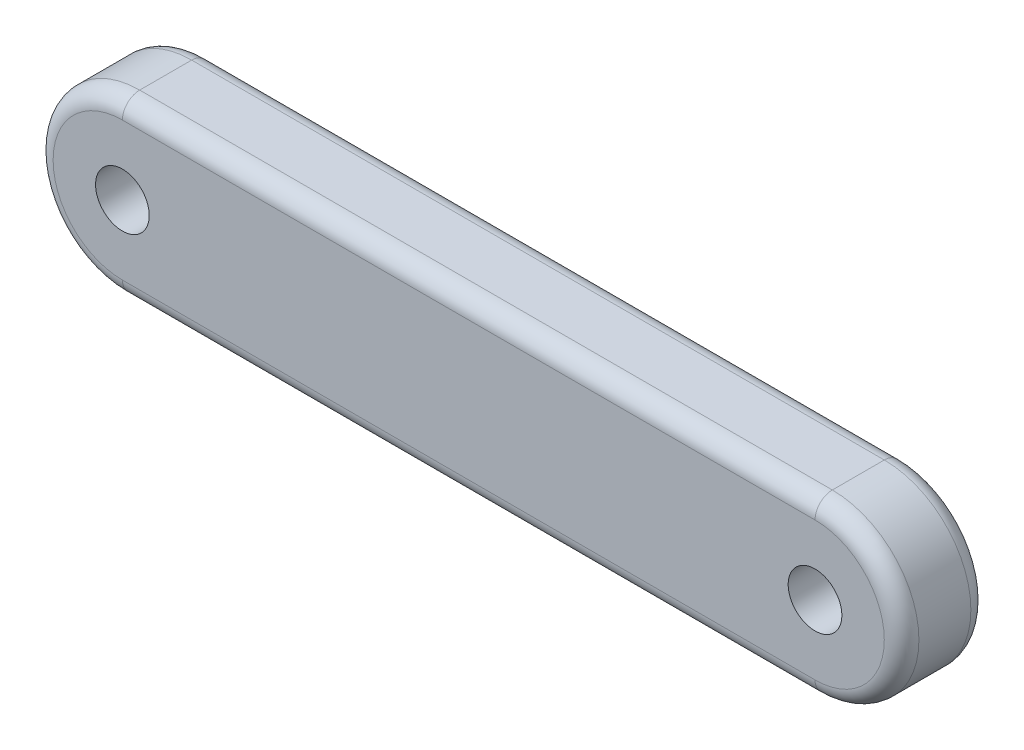
ISO-10303-21;
HEADER;
FILE_DESCRIPTION(('STEP AP214'),'2;1');
FILE_NAME('part.step','',(''),(''),'','','');
FILE_SCHEMA(('AUTOMOTIVE_DESIGN { 1 0 10303 214 1 1 1 1 }'));
ENDSEC;
DATA;
#1=APPLICATION_CONTEXT('core data for automotive mechanical design processes');
#2=APPLICATION_PROTOCOL_DEFINITION('international standard','automotive_design',2000,#1);
#3=PRODUCT_CONTEXT('',#1,'mechanical');
#4=PRODUCT('Part','Part','',(#3));
#5=PRODUCT_RELATED_PRODUCT_CATEGORY('part','',(#4));
#6=PRODUCT_DEFINITION_FORMATION('','',#4);
#7=PRODUCT_DEFINITION_CONTEXT('part definition',#1,'design');
#8=PRODUCT_DEFINITION('design','',#6,#7);
#9=PRODUCT_DEFINITION_SHAPE('','',#8);
#10=(LENGTH_UNIT() NAMED_UNIT(*) SI_UNIT(.MILLI.,.METRE.));
#11=(NAMED_UNIT(*) PLANE_ANGLE_UNIT() SI_UNIT($,.RADIAN.));
#12=(NAMED_UNIT(*) SI_UNIT($,.STERADIAN.) SOLID_ANGLE_UNIT());
#13=UNCERTAINTY_MEASURE_WITH_UNIT(LENGTH_MEASURE(1.E-05),#10,'distance_accuracy_value','');
#14=(GEOMETRIC_REPRESENTATION_CONTEXT(3) GLOBAL_UNCERTAINTY_ASSIGNED_CONTEXT((#13)) GLOBAL_UNIT_ASSIGNED_CONTEXT((#10,
#11,#12)) REPRESENTATION_CONTEXT('',''));
#15=CARTESIAN_POINT('',(0.,0.,0.));
#16=DIRECTION('',(0.,0.,1.));
#17=DIRECTION('',(1.,0.,0.));
#18=AXIS2_PLACEMENT_3D('',#15,#16,#17);
#19=CARTESIAN_POINT('',(0.,0.,12.7));
#20=DIRECTION('',(0.,0.,-1.));
#21=DIRECTION('',(-1.,0.,0.));
#22=AXIS2_PLACEMENT_3D('',#19,#20,#21);
#23=CYLINDRICAL_SURFACE('',#22,12.7);
#24=DIRECTION('',(0.,0.,-1.));
#25=VECTOR('',#24,1.);
#26=CARTESIAN_POINT('',(0.,12.7,12.7));
#27=LINE('',#26,#25);
#28=CARTESIAN_POINT('',(0.,12.7,10.16));
#29=VERTEX_POINT('',#28);
#30=CARTESIAN_POINT('',(0.,12.7,2.54));
#31=VERTEX_POINT('',#30);
#32=EDGE_CURVE('E111',#29,#31,#27,.T.);
#33=ORIENTED_EDGE('',*,*,#32,.T.);
#34=CARTESIAN_POINT('',(0.,0.,2.54));
#35=DIRECTION('',(0.,0.,1.));
#36=DIRECTION('',(1.,0.,0.));
#37=AXIS2_PLACEMENT_3D('',#34,#35,#36);
#38=CIRCLE('',#37,12.7);
#39=CARTESIAN_POINT('',(0.,-12.7,2.54));
#40=VERTEX_POINT('',#39);
#41=EDGE_CURVE('E219',#31,#40,#38,.T.);
#42=ORIENTED_EDGE('',*,*,#41,.T.);
#43=DIRECTION('',(0.,0.,-1.));
#44=VECTOR('',#43,1.);
#45=CARTESIAN_POINT('',(0.,-12.7,12.7));
#46=LINE('',#45,#44);
#47=CARTESIAN_POINT('',(0.,-12.7,10.16));
#48=VERTEX_POINT('',#47);
#49=EDGE_CURVE('E140',#48,#40,#46,.T.);
#50=ORIENTED_EDGE('',*,*,#49,.F.);
#51=CARTESIAN_POINT('',(0.,0.,10.16));
#52=DIRECTION('',(0.,0.,1.));
#53=DIRECTION('',(1.,0.,0.));
#54=AXIS2_PLACEMENT_3D('',#51,#52,#53);
#55=CIRCLE('',#54,12.7);
#56=EDGE_CURVE('E216',#48,#29,#55,.F.);
#57=ORIENTED_EDGE('',*,*,#56,.T.);
#58=EDGE_LOOP('',(#33,#42,#50,#57));
#59=FACE_BOUND('',#58,.T.);
#60=ADVANCED_FACE('F39',(#59),#23,.T.);
#61=CARTESIAN_POINT('',(0.,-12.7,12.7));
#62=DIRECTION('',(0.,1.,0.));
#63=DIRECTION('',(0.,0.,1.));
#64=AXIS2_PLACEMENT_3D('',#61,#62,#63);
#65=PLANE('',#64);
#66=ORIENTED_EDGE('',*,*,#49,.T.);
#67=DIRECTION('',(1.,0.,0.));
#68=VECTOR('',#67,1.);
#69=CARTESIAN_POINT('',(0.,-12.7,2.54));
#70=LINE('',#69,#68);
#71=CARTESIAN_POINT('',(101.6,-12.7,2.54));
#72=VERTEX_POINT('',#71);
#73=EDGE_CURVE('E213',#40,#72,#70,.T.);
#74=ORIENTED_EDGE('',*,*,#73,.T.);
#75=DIRECTION('',(0.,0.,-1.));
#76=VECTOR('',#75,1.);
#77=CARTESIAN_POINT('',(101.6,-12.7,12.7));
#78=LINE('',#77,#76);
#79=CARTESIAN_POINT('',(101.6,-12.7,10.16));
#80=VERTEX_POINT('',#79);
#81=EDGE_CURVE('E130',#80,#72,#78,.T.);
#82=ORIENTED_EDGE('',*,*,#81,.F.);
#83=DIRECTION('',(1.,0.,0.));
#84=VECTOR('',#83,1.);
#85=CARTESIAN_POINT('',(0.,-12.7,10.16));
#86=LINE('',#85,#84);
#87=EDGE_CURVE('E210',#80,#48,#86,.F.);
#88=ORIENTED_EDGE('',*,*,#87,.T.);
#89=EDGE_LOOP('',(#66,#74,#82,#88));
#90=FACE_BOUND('',#89,.T.);
#91=ADVANCED_FACE('F235',(#90),#65,.F.);
#92=CARTESIAN_POINT('',(101.6,0.,12.7));
#93=DIRECTION('',(0.,0.,-1.));
#94=DIRECTION('',(-1.,0.,0.));
#95=AXIS2_PLACEMENT_3D('',#92,#93,#94);
#96=CYLINDRICAL_SURFACE('',#95,12.7);
#97=ORIENTED_EDGE('',*,*,#81,.T.);
#98=CARTESIAN_POINT('',(101.6,0.,2.54));
#99=DIRECTION('',(0.,0.,1.));
#100=DIRECTION('',(1.,0.,0.));
#101=AXIS2_PLACEMENT_3D('',#98,#99,#100);
#102=CIRCLE('',#101,12.7);
#103=CARTESIAN_POINT('',(101.6,12.7,2.54));
#104=VERTEX_POINT('',#103);
#105=EDGE_CURVE('E128',#72,#104,#102,.T.);
#106=ORIENTED_EDGE('',*,*,#105,.T.);
#107=DIRECTION('',(0.,0.,-1.));
#108=VECTOR('',#107,1.);
#109=CARTESIAN_POINT('',(101.6,12.7,12.7));
#110=LINE('',#109,#108);
#111=CARTESIAN_POINT('',(101.6,12.7,10.16));
#112=VERTEX_POINT('',#111);
#113=EDGE_CURVE('E109',#112,#104,#110,.T.);
#114=ORIENTED_EDGE('',*,*,#113,.F.);
#115=CARTESIAN_POINT('',(101.6,0.,10.16));
#116=DIRECTION('',(0.,0.,1.));
#117=DIRECTION('',(1.,0.,0.));
#118=AXIS2_PLACEMENT_3D('',#115,#116,#117);
#119=CIRCLE('',#118,12.7);
#120=EDGE_CURVE('E125',#112,#80,#119,.F.);
#121=ORIENTED_EDGE('',*,*,#120,.T.);
#122=EDGE_LOOP('',(#97,#106,#114,#121));
#123=FACE_BOUND('',#122,.T.);
#124=ADVANCED_FACE('F124',(#123),#96,.T.);
#125=CARTESIAN_POINT('',(0.,12.7,12.7));
#126=DIRECTION('',(0.,-1.,0.));
#127=DIRECTION('',(0.,0.,-1.));
#128=AXIS2_PLACEMENT_3D('',#125,#126,#127);
#129=PLANE('',#128);
#130=ORIENTED_EDGE('',*,*,#113,.T.);
#131=DIRECTION('',(-1.,0.,0.));
#132=VECTOR('',#131,1.);
#133=CARTESIAN_POINT('',(0.,12.7,2.54));
#134=LINE('',#133,#132);
#135=EDGE_CURVE('E11',#104,#31,#134,.T.);
#136=ORIENTED_EDGE('',*,*,#135,.T.);
#137=ORIENTED_EDGE('',*,*,#32,.F.);
#138=DIRECTION('',(-1.,0.,0.));
#139=VECTOR('',#138,1.);
#140=CARTESIAN_POINT('',(101.6,12.7,10.16));
#141=LINE('',#140,#139);
#142=EDGE_CURVE('E49',#29,#112,#141,.F.);
#143=ORIENTED_EDGE('',*,*,#142,.T.);
#144=EDGE_LOOP('',(#130,#136,#137,#143));
#145=FACE_BOUND('',#144,.T.);
#146=ADVANCED_FACE('F108',(#145),#129,.F.);
#147=CARTESIAN_POINT('',(0.,0.,12.7));
#148=DIRECTION('',(0.,0.,1.));
#149=DIRECTION('',(1.,0.,0.));
#150=AXIS2_PLACEMENT_3D('',#147,#148,#149);
#151=PLANE('',#150);
#152=CARTESIAN_POINT('',(0.,0.,12.7));
#153=DIRECTION('',(0.,0.,1.));
#154=DIRECTION('',(1.,0.,0.));
#155=AXIS2_PLACEMENT_3D('',#152,#153,#154);
#156=CIRCLE('',#155,3.937);
#157=CARTESIAN_POINT('',(3.937,0.,12.7));
#158=VERTEX_POINT('',#157);
#159=EDGE_CURVE('E280',#158,#158,#156,.T.);
#160=ORIENTED_EDGE('',*,*,#159,.F.);
#161=EDGE_LOOP('',(#160));
#162=FACE_BOUND('',#161,.T.);
#163=CARTESIAN_POINT('',(101.6,0.,12.7));
#164=DIRECTION('',(0.,0.,1.));
#165=DIRECTION('',(1.,0.,0.));
#166=AXIS2_PLACEMENT_3D('',#163,#164,#165);
#167=CIRCLE('',#166,3.937);
#168=CARTESIAN_POINT('',(105.537,0.,12.7));
#169=VERTEX_POINT('',#168);
#170=EDGE_CURVE('E151',#169,#169,#167,.T.);
#171=ORIENTED_EDGE('',*,*,#170,.F.);
#172=EDGE_LOOP('',(#171));
#173=FACE_BOUND('',#172,.T.);
#174=DIRECTION('',(1.,0.,0.));
#175=VECTOR('',#174,1.);
#176=CARTESIAN_POINT('',(101.6,-10.16,12.7));
#177=LINE('',#176,#175);
#178=CARTESIAN_POINT('',(0.,-10.16,12.7));
#179=VERTEX_POINT('',#178);
#180=CARTESIAN_POINT('',(101.6,-10.16,12.7));
#181=VERTEX_POINT('',#180);
#182=EDGE_CURVE('E57',#179,#181,#177,.T.);
#183=ORIENTED_EDGE('',*,*,#182,.T.);
#184=CARTESIAN_POINT('',(101.6,0.,12.7));
#185=DIRECTION('',(0.,0.,1.));
#186=DIRECTION('',(1.,0.,0.));
#187=AXIS2_PLACEMENT_3D('',#184,#185,#186);
#188=CIRCLE('',#187,10.16);
#189=CARTESIAN_POINT('',(101.6,10.16,12.7));
#190=VERTEX_POINT('',#189);
#191=EDGE_CURVE('E117',#181,#190,#188,.T.);
#192=ORIENTED_EDGE('',*,*,#191,.T.);
#193=DIRECTION('',(-1.,0.,0.));
#194=VECTOR('',#193,1.);
#195=CARTESIAN_POINT('',(0.,10.16,12.7));
#196=LINE('',#195,#194);
#197=CARTESIAN_POINT('',(0.,10.16,12.7));
#198=VERTEX_POINT('',#197);
#199=EDGE_CURVE('E143',#190,#198,#196,.T.);
#200=ORIENTED_EDGE('',*,*,#199,.T.);
#201=CARTESIAN_POINT('',(0.,0.,12.7));
#202=DIRECTION('',(0.,0.,1.));
#203=DIRECTION('',(1.,0.,0.));
#204=AXIS2_PLACEMENT_3D('',#201,#202,#203);
#205=CIRCLE('',#204,10.16);
#206=EDGE_CURVE('E62',#198,#179,#205,.T.);
#207=ORIENTED_EDGE('',*,*,#206,.T.);
#208=EDGE_LOOP('',(#183,#192,#200,#207));
#209=FACE_BOUND('',#208,.T.);
#210=ADVANCED_FACE('F229',(#162,#173,#209),#151,.T.);
#211=CARTESIAN_POINT('',(0.,0.,0.));
#212=DIRECTION('',(0.,0.,1.));
#213=DIRECTION('',(1.,0.,0.));
#214=AXIS2_PLACEMENT_3D('',#211,#212,#213);
#215=PLANE('',#214);
#216=CARTESIAN_POINT('',(0.,0.,0.));
#217=DIRECTION('',(0.,0.,1.));
#218=DIRECTION('',(1.,0.,0.));
#219=AXIS2_PLACEMENT_3D('',#216,#217,#218);
#220=CIRCLE('',#219,3.937);
#221=CARTESIAN_POINT('',(3.937,0.,0.));
#222=VERTEX_POINT('',#221);
#223=EDGE_CURVE('E283',#222,#222,#220,.T.);
#224=ORIENTED_EDGE('',*,*,#223,.T.);
#225=EDGE_LOOP('',(#224));
#226=FACE_BOUND('',#225,.T.);
#227=CARTESIAN_POINT('',(101.6,0.,0.));
#228=DIRECTION('',(0.,0.,1.));
#229=DIRECTION('',(1.,0.,0.));
#230=AXIS2_PLACEMENT_3D('',#227,#228,#229);
#231=CIRCLE('',#230,3.937);
#232=CARTESIAN_POINT('',(105.537,0.,0.));
#233=VERTEX_POINT('',#232);
#234=EDGE_CURVE('E43',#233,#233,#231,.T.);
#235=ORIENTED_EDGE('',*,*,#234,.T.);
#236=EDGE_LOOP('',(#235));
#237=FACE_BOUND('',#236,.T.);
#238=DIRECTION('',(-1.,0.,0.));
#239=VECTOR('',#238,1.);
#240=CARTESIAN_POINT('',(0.,10.16,0.));
#241=LINE('',#240,#239);
#242=CARTESIAN_POINT('',(0.,10.16,0.));
#243=VERTEX_POINT('',#242);
#244=CARTESIAN_POINT('',(101.6,10.16,0.));
#245=VERTEX_POINT('',#244);
#246=EDGE_CURVE('E197',#243,#245,#241,.F.);
#247=ORIENTED_EDGE('',*,*,#246,.T.);
#248=CARTESIAN_POINT('',(101.6,0.,0.));
#249=DIRECTION('',(0.,0.,1.));
#250=DIRECTION('',(1.,0.,0.));
#251=AXIS2_PLACEMENT_3D('',#248,#249,#250);
#252=CIRCLE('',#251,10.16);
#253=CARTESIAN_POINT('',(101.6,-10.16,0.));
#254=VERTEX_POINT('',#253);
#255=EDGE_CURVE('E206',#245,#254,#252,.F.);
#256=ORIENTED_EDGE('',*,*,#255,.T.);
#257=DIRECTION('',(1.,0.,0.));
#258=VECTOR('',#257,1.);
#259=CARTESIAN_POINT('',(0.,-10.16,0.));
#260=LINE('',#259,#258);
#261=CARTESIAN_POINT('',(0.,-10.16,0.));
#262=VERTEX_POINT('',#261);
#263=EDGE_CURVE('E203',#254,#262,#260,.F.);
#264=ORIENTED_EDGE('',*,*,#263,.T.);
#265=CARTESIAN_POINT('',(0.,0.,0.));
#266=DIRECTION('',(0.,0.,1.));
#267=DIRECTION('',(1.,0.,0.));
#268=AXIS2_PLACEMENT_3D('',#265,#266,#267);
#269=CIRCLE('',#268,10.16);
#270=EDGE_CURVE('E200',#262,#243,#269,.F.);
#271=ORIENTED_EDGE('',*,*,#270,.T.);
#272=EDGE_LOOP('',(#247,#256,#264,#271));
#273=FACE_BOUND('',#272,.T.);
#274=ADVANCED_FACE('F261',(#226,#237,#273),#215,.F.);
#275=CARTESIAN_POINT('',(0.,0.,2.54));
#276=DIRECTION('',(0.,0.,1.));
#277=DIRECTION('',(1.,0.,0.));
#278=AXIS2_PLACEMENT_3D('',#275,#276,#277);
#279=TOROIDAL_SURFACE('',#278,10.16,2.54);
#280=CARTESIAN_POINT('',(0.,10.16,2.54));
#281=DIRECTION('',(1.,0.,0.));
#282=DIRECTION('',(0.,0.,-1.));
#283=AXIS2_PLACEMENT_3D('',#280,#281,#282);
#284=CIRCLE('',#283,2.54);
#285=EDGE_CURVE('E170',#243,#31,#284,.T.);
#286=ORIENTED_EDGE('',*,*,#285,.F.);
#287=ORIENTED_EDGE('',*,*,#270,.F.);
#288=CARTESIAN_POINT('',(0.,-10.16,2.54));
#289=DIRECTION('',(1.,0.,0.));
#290=DIRECTION('',(0.,0.,-1.));
#291=AXIS2_PLACEMENT_3D('',#288,#289,#290);
#292=CIRCLE('',#291,2.54);
#293=EDGE_CURVE('E153',#40,#262,#292,.T.);
#294=ORIENTED_EDGE('',*,*,#293,.F.);
#295=ORIENTED_EDGE('',*,*,#41,.F.);
#296=EDGE_LOOP('',(#286,#287,#294,#295));
#297=FACE_BOUND('',#296,.T.);
#298=ADVANCED_FACE('F237',(#297),#279,.T.);
#299=CARTESIAN_POINT('',(0.,-10.16,2.54));
#300=DIRECTION('',(1.,0.,0.));
#301=DIRECTION('',(0.,0.,-1.));
#302=AXIS2_PLACEMENT_3D('',#299,#300,#301);
#303=CYLINDRICAL_SURFACE('',#302,2.54);
#304=ORIENTED_EDGE('',*,*,#293,.T.);
#305=ORIENTED_EDGE('',*,*,#263,.F.);
#306=CARTESIAN_POINT('',(101.6,-10.16,2.54));
#307=DIRECTION('',(1.,0.,0.));
#308=DIRECTION('',(0.,0.,-1.));
#309=AXIS2_PLACEMENT_3D('',#306,#307,#308);
#310=CIRCLE('',#309,2.54);
#311=EDGE_CURVE('E163',#72,#254,#310,.T.);
#312=ORIENTED_EDGE('',*,*,#311,.F.);
#313=ORIENTED_EDGE('',*,*,#73,.F.);
#314=EDGE_LOOP('',(#304,#305,#312,#313));
#315=FACE_BOUND('',#314,.T.);
#316=ADVANCED_FACE('F240',(#315),#303,.T.);
#317=CARTESIAN_POINT('',(0.,10.16,2.54));
#318=DIRECTION('',(-1.,0.,0.));
#319=DIRECTION('',(0.,0.,1.));
#320=AXIS2_PLACEMENT_3D('',#317,#318,#319);
#321=CYLINDRICAL_SURFACE('',#320,2.54);
#322=ORIENTED_EDGE('',*,*,#285,.T.);
#323=ORIENTED_EDGE('',*,*,#135,.F.);
#324=CARTESIAN_POINT('',(101.6,10.16,2.54));
#325=DIRECTION('',(1.,0.,0.));
#326=DIRECTION('',(0.,0.,-1.));
#327=AXIS2_PLACEMENT_3D('',#324,#325,#326);
#328=CIRCLE('',#327,2.54);
#329=EDGE_CURVE('E160',#245,#104,#328,.T.);
#330=ORIENTED_EDGE('',*,*,#329,.F.);
#331=ORIENTED_EDGE('',*,*,#246,.F.);
#332=EDGE_LOOP('',(#322,#323,#330,#331));
#333=FACE_BOUND('',#332,.T.);
#334=ADVANCED_FACE('F243',(#333),#321,.T.);
#335=CARTESIAN_POINT('',(101.6,0.,2.54));
#336=DIRECTION('',(0.,0.,1.));
#337=DIRECTION('',(1.,0.,0.));
#338=AXIS2_PLACEMENT_3D('',#335,#336,#337);
#339=TOROIDAL_SURFACE('',#338,10.16,2.54);
#340=ORIENTED_EDGE('',*,*,#311,.T.);
#341=ORIENTED_EDGE('',*,*,#255,.F.);
#342=ORIENTED_EDGE('',*,*,#329,.T.);
#343=ORIENTED_EDGE('',*,*,#105,.F.);
#344=EDGE_LOOP('',(#340,#341,#342,#343));
#345=FACE_BOUND('',#344,.T.);
#346=ADVANCED_FACE('F241',(#345),#339,.T.);
#347=CARTESIAN_POINT('',(0.,0.,10.16));
#348=DIRECTION('',(0.,0.,1.));
#349=DIRECTION('',(1.,0.,0.));
#350=AXIS2_PLACEMENT_3D('',#347,#348,#349);
#351=TOROIDAL_SURFACE('',#350,10.16,2.54);
#352=CARTESIAN_POINT('',(0.,10.16,10.16));
#353=DIRECTION('',(1.,0.,0.));
#354=DIRECTION('',(0.,0.,-1.));
#355=AXIS2_PLACEMENT_3D('',#352,#353,#354);
#356=CIRCLE('',#355,2.54);
#357=EDGE_CURVE('E148',#29,#198,#356,.T.);
#358=ORIENTED_EDGE('',*,*,#357,.F.);
#359=ORIENTED_EDGE('',*,*,#56,.F.);
#360=CARTESIAN_POINT('',(0.,-10.16,10.16));
#361=DIRECTION('',(1.,0.,0.));
#362=DIRECTION('',(0.,0.,-1.));
#363=AXIS2_PLACEMENT_3D('',#360,#361,#362);
#364=CIRCLE('',#363,2.54);
#365=EDGE_CURVE('E157',#179,#48,#364,.T.);
#366=ORIENTED_EDGE('',*,*,#365,.F.);
#367=ORIENTED_EDGE('',*,*,#206,.F.);
#368=EDGE_LOOP('',(#358,#359,#366,#367));
#369=FACE_BOUND('',#368,.T.);
#370=ADVANCED_FACE('F41',(#369),#351,.T.);
#371=CARTESIAN_POINT('',(0.,-10.16,10.16));
#372=DIRECTION('',(-1.,0.,0.));
#373=DIRECTION('',(0.,0.,1.));
#374=AXIS2_PLACEMENT_3D('',#371,#372,#373);
#375=CYLINDRICAL_SURFACE('',#374,2.54);
#376=ORIENTED_EDGE('',*,*,#365,.T.);
#377=ORIENTED_EDGE('',*,*,#87,.F.);
#378=CARTESIAN_POINT('',(101.6,-10.16,10.16));
#379=DIRECTION('',(1.,0.,0.));
#380=DIRECTION('',(0.,0.,-1.));
#381=AXIS2_PLACEMENT_3D('',#378,#379,#380);
#382=CIRCLE('',#381,2.54);
#383=EDGE_CURVE('E137',#181,#80,#382,.T.);
#384=ORIENTED_EDGE('',*,*,#383,.F.);
#385=ORIENTED_EDGE('',*,*,#182,.F.);
#386=EDGE_LOOP('',(#376,#377,#384,#385));
#387=FACE_BOUND('',#386,.T.);
#388=ADVANCED_FACE('F232',(#387),#375,.T.);
#389=CARTESIAN_POINT('',(0.,10.16,10.16));
#390=DIRECTION('',(1.,0.,0.));
#391=DIRECTION('',(0.,0.,-1.));
#392=AXIS2_PLACEMENT_3D('',#389,#390,#391);
#393=CYLINDRICAL_SURFACE('',#392,2.54);
#394=ORIENTED_EDGE('',*,*,#357,.T.);
#395=ORIENTED_EDGE('',*,*,#199,.F.);
#396=CARTESIAN_POINT('',(101.6,10.16,10.16));
#397=DIRECTION('',(1.,0.,0.));
#398=DIRECTION('',(0.,0.,-1.));
#399=AXIS2_PLACEMENT_3D('',#396,#397,#398);
#400=CIRCLE('',#399,2.54);
#401=EDGE_CURVE('E135',#112,#190,#400,.T.);
#402=ORIENTED_EDGE('',*,*,#401,.F.);
#403=ORIENTED_EDGE('',*,*,#142,.F.);
#404=EDGE_LOOP('',(#394,#395,#402,#403));
#405=FACE_BOUND('',#404,.T.);
#406=ADVANCED_FACE('F142',(#405),#393,.T.);
#407=CARTESIAN_POINT('',(101.6,0.,10.16));
#408=DIRECTION('',(0.,0.,1.));
#409=DIRECTION('',(1.,0.,0.));
#410=AXIS2_PLACEMENT_3D('',#407,#408,#409);
#411=TOROIDAL_SURFACE('',#410,10.16,2.54);
#412=ORIENTED_EDGE('',*,*,#383,.T.);
#413=ORIENTED_EDGE('',*,*,#120,.F.);
#414=ORIENTED_EDGE('',*,*,#401,.T.);
#415=ORIENTED_EDGE('',*,*,#191,.F.);
#416=EDGE_LOOP('',(#412,#413,#414,#415));
#417=FACE_BOUND('',#416,.T.);
#418=ADVANCED_FACE('F133',(#417),#411,.T.);
#419=CARTESIAN_POINT('',(101.6,0.,12.7));
#420=DIRECTION('',(0.,0.,1.));
#421=DIRECTION('',(1.,0.,0.));
#422=AXIS2_PLACEMENT_3D('',#419,#420,#421);
#423=CYLINDRICAL_SURFACE('',#422,3.937);
#424=ORIENTED_EDGE('',*,*,#170,.T.);
#425=EDGE_LOOP('',(#424));
#426=FACE_BOUND('',#425,.T.);
#427=ORIENTED_EDGE('',*,*,#234,.F.);
#428=EDGE_LOOP('',(#427));
#429=FACE_BOUND('',#428,.T.);
#430=ADVANCED_FACE('F268',(#426,#429),#423,.F.);
#431=CARTESIAN_POINT('',(0.,0.,12.7));
#432=DIRECTION('',(0.,0.,1.));
#433=DIRECTION('',(1.,0.,0.));
#434=AXIS2_PLACEMENT_3D('',#431,#432,#433);
#435=CYLINDRICAL_SURFACE('',#434,3.937);
#436=ORIENTED_EDGE('',*,*,#159,.T.);
#437=EDGE_LOOP('',(#436));
#438=FACE_BOUND('',#437,.T.);
#439=ORIENTED_EDGE('',*,*,#223,.F.);
#440=EDGE_LOOP('',(#439));
#441=FACE_BOUND('',#440,.T.);
#442=ADVANCED_FACE('F271',(#438,#441),#435,.F.);
#443=CLOSED_SHELL('',(#60,#91,#124,#146,#210,#274,#298,#316,#334,#346,#370,#388,#406,#418,#430,#442));
#444=MANIFOLD_SOLID_BREP('B2',#443);
#445=ADVANCED_BREP_SHAPE_REPRESENTATION('',(#18,#444),#14);
#446=SHAPE_DEFINITION_REPRESENTATION(#9,#445);
ENDSEC;
END-ISO-10303-21;
